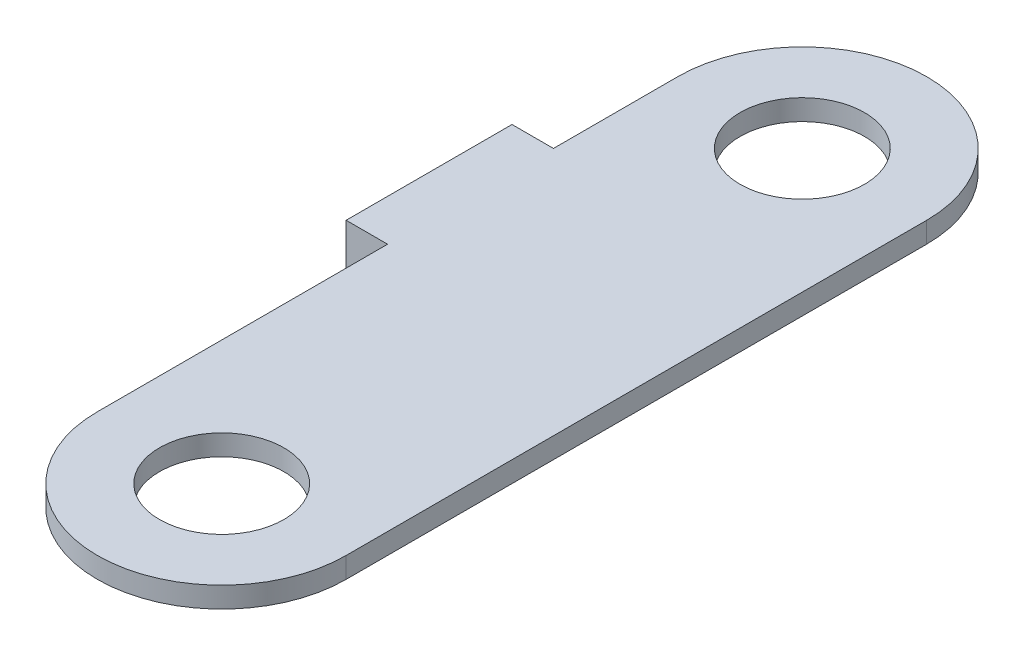
ISO-10303-21;
HEADER;
FILE_DESCRIPTION(('STEP AP214'),'2;1');
FILE_NAME('part.step','',(''),(''),'','','');
FILE_SCHEMA(('AUTOMOTIVE_DESIGN { 1 0 10303 214 1 1 1 1 }'));
ENDSEC;
DATA;
#1=APPLICATION_CONTEXT('core data for automotive mechanical design processes');
#2=APPLICATION_PROTOCOL_DEFINITION('international standard','automotive_design',2000,#1);
#3=PRODUCT_CONTEXT('',#1,'mechanical');
#4=PRODUCT('Part','Part','',(#3));
#5=PRODUCT_RELATED_PRODUCT_CATEGORY('part','',(#4));
#6=PRODUCT_DEFINITION_FORMATION('','',#4);
#7=PRODUCT_DEFINITION_CONTEXT('part definition',#1,'design');
#8=PRODUCT_DEFINITION('design','',#6,#7);
#9=PRODUCT_DEFINITION_SHAPE('','',#8);
#10=(LENGTH_UNIT() NAMED_UNIT(*) SI_UNIT(.MILLI.,.METRE.));
#11=(NAMED_UNIT(*) PLANE_ANGLE_UNIT() SI_UNIT($,.RADIAN.));
#12=(NAMED_UNIT(*) SI_UNIT($,.STERADIAN.) SOLID_ANGLE_UNIT());
#13=UNCERTAINTY_MEASURE_WITH_UNIT(LENGTH_MEASURE(1.E-05),#10,'distance_accuracy_value','');
#14=(GEOMETRIC_REPRESENTATION_CONTEXT(3) GLOBAL_UNCERTAINTY_ASSIGNED_CONTEXT((#13)) GLOBAL_UNIT_ASSIGNED_CONTEXT((#10,
#11,#12)) REPRESENTATION_CONTEXT('',''));
#15=CARTESIAN_POINT('',(0.,0.,0.));
#16=DIRECTION('',(0.,0.,1.));
#17=DIRECTION('',(1.,0.,0.));
#18=AXIS2_PLACEMENT_3D('',#15,#16,#17);
#19=CARTESIAN_POINT('',(-38.1,6.35,0.));
#20=DIRECTION('',(1.,0.,0.));
#21=DIRECTION('',(0.,0.,-1.));
#22=AXIS2_PLACEMENT_3D('',#19,#20,#21);
#23=PLANE('',#22);
#24=DIRECTION('',(0.,0.,1.));
#25=VECTOR('',#24,1.);
#26=CARTESIAN_POINT('',(-38.1,6.35,0.));
#27=LINE('',#26,#25);
#28=CARTESIAN_POINT('',(-38.1,6.35,88.9));
#29=VERTEX_POINT('',#28);
#30=CARTESIAN_POINT('',(-38.1,6.35,177.8));
#31=VERTEX_POINT('',#30);
#32=EDGE_CURVE('E167',#29,#31,#27,.T.);
#33=ORIENTED_EDGE('',*,*,#32,.F.);
#34=DIRECTION('',(0.,-1.,0.));
#35=VECTOR('',#34,1.);
#36=CARTESIAN_POINT('',(-38.1,6.35,88.9));
#37=LINE('',#36,#35);
#38=CARTESIAN_POINT('',(-38.1,0.,88.9));
#39=VERTEX_POINT('',#38);
#40=EDGE_CURVE('E11',#29,#39,#37,.T.);
#41=ORIENTED_EDGE('',*,*,#40,.T.);
#42=DIRECTION('',(0.,0.,1.));
#43=VECTOR('',#42,1.);
#44=CARTESIAN_POINT('',(-38.1,0.,0.));
#45=LINE('',#44,#43);
#46=CARTESIAN_POINT('',(-38.1,0.,177.8));
#47=VERTEX_POINT('',#46);
#48=EDGE_CURVE('E175',#39,#47,#45,.T.);
#49=ORIENTED_EDGE('',*,*,#48,.T.);
#50=DIRECTION('',(0.,-1.,0.));
#51=VECTOR('',#50,1.);
#52=CARTESIAN_POINT('',(-38.1,6.35,177.8));
#53=LINE('',#52,#51);
#54=EDGE_CURVE('E186',#31,#47,#53,.T.);
#55=ORIENTED_EDGE('',*,*,#54,.F.);
#56=EDGE_LOOP('',(#33,#41,#49,#55));
#57=FACE_BOUND('',#56,.T.);
#58=ADVANCED_FACE('F33',(#57),#23,.F.);
#59=CARTESIAN_POINT('',(0.,6.35,0.));
#60=DIRECTION('',(0.,1.,0.));
#61=DIRECTION('',(0.,0.,1.));
#62=AXIS2_PLACEMENT_3D('',#59,#60,#61);
#63=PLANE('',#62);
#64=CARTESIAN_POINT('',(0.,6.35,0.));
#65=DIRECTION('',(0.,1.,0.));
#66=DIRECTION('',(0.,0.,1.));
#67=AXIS2_PLACEMENT_3D('',#64,#65,#66);
#68=CIRCLE('',#67,19.05);
#69=CARTESIAN_POINT('',(0.,6.35,19.05));
#70=VERTEX_POINT('',#69);
#71=EDGE_CURVE('E159',#70,#70,#68,.T.);
#72=ORIENTED_EDGE('',*,*,#71,.F.);
#73=EDGE_LOOP('',(#72));
#74=FACE_BOUND('',#73,.T.);
#75=CARTESIAN_POINT('',(0.,6.35,0.));
#76=DIRECTION('',(0.,1.,0.));
#77=DIRECTION('',(0.,0.,1.));
#78=AXIS2_PLACEMENT_3D('',#75,#76,#77);
#79=CIRCLE('',#78,38.1);
#80=CARTESIAN_POINT('',(38.1,6.35,0.));
#81=VERTEX_POINT('',#80);
#82=CARTESIAN_POINT('',(-38.1,6.35,0.));
#83=VERTEX_POINT('',#82);
#84=EDGE_CURVE('E165',#81,#83,#79,.T.);
#85=ORIENTED_EDGE('',*,*,#84,.T.);
#86=CARTESIAN_POINT('',(-38.1,6.35,38.1));
#87=VERTEX_POINT('',#86);
#88=EDGE_CURVE('E85',#83,#87,#27,.T.);
#89=ORIENTED_EDGE('',*,*,#88,.T.);
#90=DIRECTION('',(-1.,0.,0.));
#91=VECTOR('',#90,1.);
#92=CARTESIAN_POINT('',(-50.8,6.35,38.1));
#93=LINE('',#92,#91);
#94=CARTESIAN_POINT('',(-50.8,6.35,38.1));
#95=VERTEX_POINT('',#94);
#96=EDGE_CURVE('E144',#87,#95,#93,.T.);
#97=ORIENTED_EDGE('',*,*,#96,.T.);
#98=DIRECTION('',(0.,0.,1.));
#99=VECTOR('',#98,1.);
#100=CARTESIAN_POINT('',(-50.8,6.35,88.9));
#101=LINE('',#100,#99);
#102=CARTESIAN_POINT('',(-50.8,6.35,88.9));
#103=VERTEX_POINT('',#102);
#104=EDGE_CURVE('E139',#95,#103,#101,.T.);
#105=ORIENTED_EDGE('',*,*,#104,.T.);
#106=DIRECTION('',(1.,0.,0.));
#107=VECTOR('',#106,1.);
#108=CARTESIAN_POINT('',(-38.1,6.35,88.9));
#109=LINE('',#108,#107);
#110=EDGE_CURVE('E48',#103,#29,#109,.T.);
#111=ORIENTED_EDGE('',*,*,#110,.T.);
#112=ORIENTED_EDGE('',*,*,#32,.T.);
#113=CARTESIAN_POINT('',(0.,6.35,177.8));
#114=DIRECTION('',(0.,1.,0.));
#115=DIRECTION('',(0.,0.,1.));
#116=AXIS2_PLACEMENT_3D('',#113,#114,#115);
#117=CIRCLE('',#116,38.1);
#118=CARTESIAN_POINT('',(38.1,6.35,177.8));
#119=VERTEX_POINT('',#118);
#120=EDGE_CURVE('E169',#31,#119,#117,.T.);
#121=ORIENTED_EDGE('',*,*,#120,.T.);
#122=DIRECTION('',(0.,0.,-1.));
#123=VECTOR('',#122,1.);
#124=CARTESIAN_POINT('',(38.1,6.35,0.));
#125=LINE('',#124,#123);
#126=EDGE_CURVE('E56',#119,#81,#125,.T.);
#127=ORIENTED_EDGE('',*,*,#126,.T.);
#128=EDGE_LOOP('',(#85,#89,#97,#105,#111,#112,#121,#127));
#129=FACE_BOUND('',#128,.T.);
#130=CARTESIAN_POINT('',(0.,6.35,177.8));
#131=DIRECTION('',(0.,1.,0.));
#132=DIRECTION('',(0.,0.,1.));
#133=AXIS2_PLACEMENT_3D('',#130,#131,#132);
#134=CIRCLE('',#133,19.05);
#135=CARTESIAN_POINT('',(0.,6.35,196.85));
#136=VERTEX_POINT('',#135);
#137=EDGE_CURVE('E153',#136,#136,#134,.T.);
#138=ORIENTED_EDGE('',*,*,#137,.F.);
#139=EDGE_LOOP('',(#138));
#140=FACE_BOUND('',#139,.T.);
#141=ADVANCED_FACE('F191',(#74,#129,#140),#63,.T.);
#142=CARTESIAN_POINT('',(0.,0.,0.));
#143=DIRECTION('',(0.,1.,0.));
#144=DIRECTION('',(0.,0.,1.));
#145=AXIS2_PLACEMENT_3D('',#142,#143,#144);
#146=PLANE('',#145);
#147=CARTESIAN_POINT('',(0.,0.,0.));
#148=DIRECTION('',(0.,1.,0.));
#149=DIRECTION('',(0.,0.,1.));
#150=AXIS2_PLACEMENT_3D('',#147,#148,#149);
#151=CIRCLE('',#150,38.1);
#152=CARTESIAN_POINT('',(38.1,0.,0.));
#153=VERTEX_POINT('',#152);
#154=CARTESIAN_POINT('',(-38.1,0.,0.));
#155=VERTEX_POINT('',#154);
#156=EDGE_CURVE('E162',#153,#155,#151,.T.);
#157=ORIENTED_EDGE('',*,*,#156,.F.);
#158=DIRECTION('',(0.,0.,-1.));
#159=VECTOR('',#158,1.);
#160=CARTESIAN_POINT('',(38.1,0.,0.));
#161=LINE('',#160,#159);
#162=CARTESIAN_POINT('',(38.1,0.,177.8));
#163=VERTEX_POINT('',#162);
#164=EDGE_CURVE('E77',#163,#153,#161,.T.);
#165=ORIENTED_EDGE('',*,*,#164,.F.);
#166=CARTESIAN_POINT('',(0.,0.,177.8));
#167=DIRECTION('',(0.,1.,0.));
#168=DIRECTION('',(0.,0.,1.));
#169=AXIS2_PLACEMENT_3D('',#166,#167,#168);
#170=CIRCLE('',#169,38.1);
#171=EDGE_CURVE('E179',#47,#163,#170,.T.);
#172=ORIENTED_EDGE('',*,*,#171,.F.);
#173=ORIENTED_EDGE('',*,*,#48,.F.);
#174=CARTESIAN_POINT('',(-38.1,0.,38.1));
#175=VERTEX_POINT('',#174);
#176=EDGE_CURVE('E180',#175,#39,#45,.T.);
#177=ORIENTED_EDGE('',*,*,#176,.F.);
#178=EDGE_CURVE('E176',#155,#175,#45,.T.);
#179=ORIENTED_EDGE('',*,*,#178,.F.);
#180=EDGE_LOOP('',(#157,#165,#172,#173,#177,#179));
#181=FACE_BOUND('',#180,.T.);
#182=CARTESIAN_POINT('',(0.,0.,0.));
#183=DIRECTION('',(0.,1.,0.));
#184=DIRECTION('',(0.,0.,1.));
#185=AXIS2_PLACEMENT_3D('',#182,#183,#184);
#186=CIRCLE('',#185,19.05);
#187=CARTESIAN_POINT('',(0.,0.,19.05));
#188=VERTEX_POINT('',#187);
#189=EDGE_CURVE('E156',#188,#188,#186,.T.);
#190=ORIENTED_EDGE('',*,*,#189,.T.);
#191=EDGE_LOOP('',(#190));
#192=FACE_BOUND('',#191,.T.);
#193=CARTESIAN_POINT('',(0.,0.,177.8));
#194=DIRECTION('',(0.,1.,0.));
#195=DIRECTION('',(0.,0.,1.));
#196=AXIS2_PLACEMENT_3D('',#193,#194,#195);
#197=CIRCLE('',#196,19.05);
#198=CARTESIAN_POINT('',(0.,0.,196.85));
#199=VERTEX_POINT('',#198);
#200=EDGE_CURVE('E149',#199,#199,#197,.T.);
#201=ORIENTED_EDGE('',*,*,#200,.T.);
#202=EDGE_LOOP('',(#201));
#203=FACE_BOUND('',#202,.T.);
#204=ADVANCED_FACE('F198',(#181,#192,#203),#146,.F.);
#205=CARTESIAN_POINT('',(0.,6.35,0.));
#206=DIRECTION('',(0.,-1.,0.));
#207=DIRECTION('',(0.,0.,-1.));
#208=AXIS2_PLACEMENT_3D('',#205,#206,#207);
#209=CYLINDRICAL_SURFACE('',#208,38.1);
#210=ORIENTED_EDGE('',*,*,#156,.T.);
#211=DIRECTION('',(0.,-1.,0.));
#212=VECTOR('',#211,1.);
#213=CARTESIAN_POINT('',(-38.1,6.35,0.));
#214=LINE('',#213,#212);
#215=EDGE_CURVE('E189',#83,#155,#214,.T.);
#216=ORIENTED_EDGE('',*,*,#215,.F.);
#217=ORIENTED_EDGE('',*,*,#84,.F.);
#218=DIRECTION('',(0.,-1.,0.));
#219=VECTOR('',#218,1.);
#220=CARTESIAN_POINT('',(38.1,6.35,0.));
#221=LINE('',#220,#219);
#222=EDGE_CURVE('E172',#81,#153,#221,.T.);
#223=ORIENTED_EDGE('',*,*,#222,.T.);
#224=EDGE_LOOP('',(#210,#216,#217,#223));
#225=FACE_BOUND('',#224,.T.);
#226=ADVANCED_FACE('F35',(#225),#209,.T.);
#227=ORIENTED_EDGE('',*,*,#178,.T.);
#228=DIRECTION('',(0.,1.,0.));
#229=VECTOR('',#228,1.);
#230=CARTESIAN_POINT('',(-38.1,6.35,38.1));
#231=LINE('',#230,#229);
#232=EDGE_CURVE('E41',#175,#87,#231,.T.);
#233=ORIENTED_EDGE('',*,*,#232,.T.);
#234=ORIENTED_EDGE('',*,*,#88,.F.);
#235=ORIENTED_EDGE('',*,*,#215,.T.);
#236=EDGE_LOOP('',(#227,#233,#234,#235));
#237=FACE_BOUND('',#236,.T.);
#238=ADVANCED_FACE('F190',(#237),#23,.F.);
#239=CARTESIAN_POINT('',(0.,6.35,177.8));
#240=DIRECTION('',(0.,-1.,0.));
#241=DIRECTION('',(0.,0.,-1.));
#242=AXIS2_PLACEMENT_3D('',#239,#240,#241);
#243=CYLINDRICAL_SURFACE('',#242,38.1);
#244=ORIENTED_EDGE('',*,*,#171,.T.);
#245=DIRECTION('',(0.,-1.,0.));
#246=VECTOR('',#245,1.);
#247=CARTESIAN_POINT('',(38.1,6.35,177.8));
#248=LINE('',#247,#246);
#249=EDGE_CURVE('E184',#119,#163,#248,.T.);
#250=ORIENTED_EDGE('',*,*,#249,.F.);
#251=ORIENTED_EDGE('',*,*,#120,.F.);
#252=ORIENTED_EDGE('',*,*,#54,.T.);
#253=EDGE_LOOP('',(#244,#250,#251,#252));
#254=FACE_BOUND('',#253,.T.);
#255=ADVANCED_FACE('F207',(#254),#243,.T.);
#256=CARTESIAN_POINT('',(38.1,6.35,0.));
#257=DIRECTION('',(-1.,0.,0.));
#258=DIRECTION('',(0.,0.,1.));
#259=AXIS2_PLACEMENT_3D('',#256,#257,#258);
#260=PLANE('',#259);
#261=ORIENTED_EDGE('',*,*,#164,.T.);
#262=ORIENTED_EDGE('',*,*,#222,.F.);
#263=ORIENTED_EDGE('',*,*,#126,.F.);
#264=ORIENTED_EDGE('',*,*,#249,.T.);
#265=EDGE_LOOP('',(#261,#262,#263,#264));
#266=FACE_BOUND('',#265,.T.);
#267=ADVANCED_FACE('F209',(#266),#260,.F.);
#268=CARTESIAN_POINT('',(0.,6.35,0.));
#269=DIRECTION('',(0.,-1.,0.));
#270=DIRECTION('',(0.,0.,-1.));
#271=AXIS2_PLACEMENT_3D('',#268,#269,#270);
#272=CYLINDRICAL_SURFACE('',#271,19.05);
#273=ORIENTED_EDGE('',*,*,#71,.T.);
#274=EDGE_LOOP('',(#273));
#275=FACE_BOUND('',#274,.T.);
#276=ORIENTED_EDGE('',*,*,#189,.F.);
#277=EDGE_LOOP('',(#276));
#278=FACE_BOUND('',#277,.T.);
#279=ADVANCED_FACE('F211',(#275,#278),#272,.F.);
#280=CARTESIAN_POINT('',(0.,6.35,177.8));
#281=DIRECTION('',(0.,-1.,0.));
#282=DIRECTION('',(0.,0.,-1.));
#283=AXIS2_PLACEMENT_3D('',#280,#281,#282);
#284=CYLINDRICAL_SURFACE('',#283,19.05);
#285=ORIENTED_EDGE('',*,*,#137,.T.);
#286=EDGE_LOOP('',(#285));
#287=FACE_BOUND('',#286,.T.);
#288=ORIENTED_EDGE('',*,*,#200,.F.);
#289=EDGE_LOOP('',(#288));
#290=FACE_BOUND('',#289,.T.);
#291=ADVANCED_FACE('F217',(#287,#290),#284,.F.);
#292=CARTESIAN_POINT('',(-38.1,-19.05,38.1));
#293=DIRECTION('',(1.,0.,0.));
#294=DIRECTION('',(0.,0.,-1.));
#295=AXIS2_PLACEMENT_3D('',#292,#293,#294);
#296=PLANE('',#295);
#297=ORIENTED_EDGE('',*,*,#176,.T.);
#298=DIRECTION('',(0.,1.,0.));
#299=VECTOR('',#298,1.);
#300=CARTESIAN_POINT('',(-38.1,-19.05,88.9));
#301=LINE('',#300,#299);
#302=CARTESIAN_POINT('',(-38.1,-19.05,88.9));
#303=VERTEX_POINT('',#302);
#304=EDGE_CURVE('E137',#303,#39,#301,.T.);
#305=ORIENTED_EDGE('',*,*,#304,.F.);
#306=DIRECTION('',(0.,0.,-1.));
#307=VECTOR('',#306,1.);
#308=CARTESIAN_POINT('',(-38.1,-19.05,38.1));
#309=LINE('',#308,#307);
#310=CARTESIAN_POINT('',(-38.1,-19.05,38.1));
#311=VERTEX_POINT('',#310);
#312=EDGE_CURVE('E130',#303,#311,#309,.T.);
#313=ORIENTED_EDGE('',*,*,#312,.T.);
#314=DIRECTION('',(0.,1.,0.));
#315=VECTOR('',#314,1.);
#316=CARTESIAN_POINT('',(-38.1,-19.05,38.1));
#317=LINE('',#316,#315);
#318=EDGE_CURVE('E115',#311,#175,#317,.T.);
#319=ORIENTED_EDGE('',*,*,#318,.T.);
#320=EDGE_LOOP('',(#297,#305,#313,#319));
#321=FACE_BOUND('',#320,.T.);
#322=ADVANCED_FACE('F135',(#321),#296,.T.);
#323=CARTESIAN_POINT('',(-38.1,-19.05,88.9));
#324=DIRECTION('',(0.,0.,1.));
#325=DIRECTION('',(1.,0.,0.));
#326=AXIS2_PLACEMENT_3D('',#323,#324,#325);
#327=PLANE('',#326);
#328=ORIENTED_EDGE('',*,*,#110,.F.);
#329=DIRECTION('',(0.,1.,0.));
#330=VECTOR('',#329,1.);
#331=CARTESIAN_POINT('',(-50.8,-19.05,88.9));
#332=LINE('',#331,#330);
#333=CARTESIAN_POINT('',(-50.8,-19.05,88.9));
#334=VERTEX_POINT('',#333);
#335=EDGE_CURVE('E150',#334,#103,#332,.T.);
#336=ORIENTED_EDGE('',*,*,#335,.F.);
#337=DIRECTION('',(1.,0.,0.));
#338=VECTOR('',#337,1.);
#339=CARTESIAN_POINT('',(-38.1,-19.05,88.9));
#340=LINE('',#339,#338);
#341=EDGE_CURVE('E123',#334,#303,#340,.T.);
#342=ORIENTED_EDGE('',*,*,#341,.T.);
#343=ORIENTED_EDGE('',*,*,#304,.T.);
#344=ORIENTED_EDGE('',*,*,#40,.F.);
#345=EDGE_LOOP('',(#328,#336,#342,#343,#344));
#346=FACE_BOUND('',#345,.T.);
#347=ADVANCED_FACE('F243',(#346),#327,.T.);
#348=CARTESIAN_POINT('',(-50.8,-19.05,88.9));
#349=DIRECTION('',(-1.,0.,0.));
#350=DIRECTION('',(0.,0.,1.));
#351=AXIS2_PLACEMENT_3D('',#348,#349,#350);
#352=PLANE('',#351);
#353=ORIENTED_EDGE('',*,*,#104,.F.);
#354=DIRECTION('',(0.,1.,0.));
#355=VECTOR('',#354,1.);
#356=CARTESIAN_POINT('',(-50.8,-19.05,38.1));
#357=LINE('',#356,#355);
#358=CARTESIAN_POINT('',(-50.8,-19.05,38.1));
#359=VERTEX_POINT('',#358);
#360=EDGE_CURVE('E122',#359,#95,#357,.T.);
#361=ORIENTED_EDGE('',*,*,#360,.F.);
#362=DIRECTION('',(0.,0.,1.));
#363=VECTOR('',#362,1.);
#364=CARTESIAN_POINT('',(-50.8,-19.05,88.9));
#365=LINE('',#364,#363);
#366=EDGE_CURVE('E133',#359,#334,#365,.T.);
#367=ORIENTED_EDGE('',*,*,#366,.T.);
#368=ORIENTED_EDGE('',*,*,#335,.T.);
#369=EDGE_LOOP('',(#353,#361,#367,#368));
#370=FACE_BOUND('',#369,.T.);
#371=ADVANCED_FACE('F246',(#370),#352,.T.);
#372=CARTESIAN_POINT('',(-50.8,-19.05,38.1));
#373=DIRECTION('',(0.,0.,-1.));
#374=DIRECTION('',(-1.,0.,0.));
#375=AXIS2_PLACEMENT_3D('',#372,#373,#374);
#376=PLANE('',#375);
#377=ORIENTED_EDGE('',*,*,#96,.F.);
#378=ORIENTED_EDGE('',*,*,#232,.F.);
#379=ORIENTED_EDGE('',*,*,#318,.F.);
#380=DIRECTION('',(-1.,0.,0.));
#381=VECTOR('',#380,1.);
#382=CARTESIAN_POINT('',(-50.8,-19.05,38.1));
#383=LINE('',#382,#381);
#384=EDGE_CURVE('E118',#311,#359,#383,.T.);
#385=ORIENTED_EDGE('',*,*,#384,.T.);
#386=ORIENTED_EDGE('',*,*,#360,.T.);
#387=EDGE_LOOP('',(#377,#378,#379,#385,#386));
#388=FACE_BOUND('',#387,.T.);
#389=ADVANCED_FACE('F117',(#388),#376,.T.);
#390=CARTESIAN_POINT('',(0.,-19.05,0.));
#391=DIRECTION('',(0.,-1.,0.));
#392=DIRECTION('',(0.,0.,-1.));
#393=AXIS2_PLACEMENT_3D('',#390,#391,#392);
#394=PLANE('',#393);
#395=ORIENTED_EDGE('',*,*,#312,.F.);
#396=ORIENTED_EDGE('',*,*,#341,.F.);
#397=ORIENTED_EDGE('',*,*,#366,.F.);
#398=ORIENTED_EDGE('',*,*,#384,.F.);
#399=EDGE_LOOP('',(#395,#396,#397,#398));
#400=FACE_BOUND('',#399,.T.);
#401=ADVANCED_FACE('F128',(#400),#394,.T.);
#402=CLOSED_SHELL('',(#58,#141,#204,#226,#238,#255,#267,#279,#291,#322,#347,#371,#389,#401));
#403=MANIFOLD_SOLID_BREP('B2',#402);
#404=ADVANCED_BREP_SHAPE_REPRESENTATION('',(#18,#403),#14);
#405=SHAPE_DEFINITION_REPRESENTATION(#9,#404);
ENDSEC;
END-ISO-10303-21;
